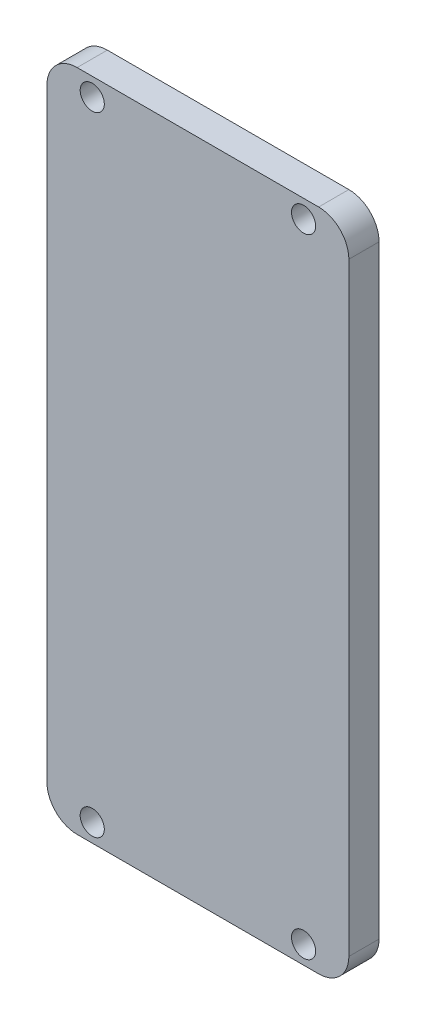
ISO-10303-21;
HEADER;
FILE_DESCRIPTION(('STEP AP214'),'2;1');
FILE_NAME('part.step','',(''),(''),'','','');
FILE_SCHEMA(('AUTOMOTIVE_DESIGN { 1 0 10303 214 1 1 1 1 }'));
ENDSEC;
DATA;
#1=APPLICATION_CONTEXT('core data for automotive mechanical design processes');
#2=APPLICATION_PROTOCOL_DEFINITION('international standard','automotive_design',2000,#1);
#3=PRODUCT_CONTEXT('',#1,'mechanical');
#4=PRODUCT('Part','Part','',(#3));
#5=PRODUCT_RELATED_PRODUCT_CATEGORY('part','',(#4));
#6=PRODUCT_DEFINITION_FORMATION('','',#4);
#7=PRODUCT_DEFINITION_CONTEXT('part definition',#1,'design');
#8=PRODUCT_DEFINITION('design','',#6,#7);
#9=PRODUCT_DEFINITION_SHAPE('','',#8);
#10=(LENGTH_UNIT() NAMED_UNIT(*) SI_UNIT(.MILLI.,.METRE.));
#11=(NAMED_UNIT(*) PLANE_ANGLE_UNIT() SI_UNIT($,.RADIAN.));
#12=(NAMED_UNIT(*) SI_UNIT($,.STERADIAN.) SOLID_ANGLE_UNIT());
#13=UNCERTAINTY_MEASURE_WITH_UNIT(LENGTH_MEASURE(1.E-05),#10,'distance_accuracy_value','');
#14=(GEOMETRIC_REPRESENTATION_CONTEXT(3) GLOBAL_UNCERTAINTY_ASSIGNED_CONTEXT((#13)) GLOBAL_UNIT_ASSIGNED_CONTEXT((#10,
#11,#12)) REPRESENTATION_CONTEXT('',''));
#15=CARTESIAN_POINT('',(0.,0.,0.));
#16=DIRECTION('',(0.,0.,1.));
#17=DIRECTION('',(1.,0.,0.));
#18=AXIS2_PLACEMENT_3D('',#15,#16,#17);
#19=CARTESIAN_POINT('',(5.,-105.,5.));
#20=DIRECTION('',(0.,0.,-1.));
#21=DIRECTION('',(-1.,0.,0.));
#22=AXIS2_PLACEMENT_3D('',#19,#20,#21);
#23=CYLINDRICAL_SURFACE('',#22,5.);
#24=CARTESIAN_POINT('',(5.,-105.,0.));
#25=DIRECTION('',(0.,0.,1.));
#26=DIRECTION('',(-1.,0.,0.));
#27=AXIS2_PLACEMENT_3D('',#24,#25,#26);
#28=CIRCLE('',#27,5.);
#29=CARTESIAN_POINT('',(0.,-105.,0.));
#30=VERTEX_POINT('',#29);
#31=CARTESIAN_POINT('',(5.00000000000004,-110.,0.));
#32=VERTEX_POINT('',#31);
#33=EDGE_CURVE('E139',#30,#32,#28,.T.);
#34=ORIENTED_EDGE('',*,*,#33,.T.);
#35=DIRECTION('',(0.,0.,-1.));
#36=VECTOR('',#35,1.);
#37=CARTESIAN_POINT('',(5.00000000000004,-110.,5.));
#38=LINE('',#37,#36);
#39=CARTESIAN_POINT('',(5.00000000000004,-110.,5.));
#40=VERTEX_POINT('',#39);
#41=EDGE_CURVE('E11',#40,#32,#38,.T.);
#42=ORIENTED_EDGE('',*,*,#41,.F.);
#43=CARTESIAN_POINT('',(5.,-105.,5.));
#44=DIRECTION('',(0.,0.,1.));
#45=DIRECTION('',(-1.,0.,0.));
#46=AXIS2_PLACEMENT_3D('',#43,#44,#45);
#47=CIRCLE('',#46,5.);
#48=CARTESIAN_POINT('',(0.,-105.,5.));
#49=VERTEX_POINT('',#48);
#50=EDGE_CURVE('E162',#49,#40,#47,.T.);
#51=ORIENTED_EDGE('',*,*,#50,.F.);
#52=DIRECTION('',(0.,0.,-1.));
#53=VECTOR('',#52,1.);
#54=CARTESIAN_POINT('',(0.,-105.,5.));
#55=LINE('',#54,#53);
#56=EDGE_CURVE('E135',#49,#30,#55,.T.);
#57=ORIENTED_EDGE('',*,*,#56,.T.);
#58=EDGE_LOOP('',(#34,#42,#51,#57));
#59=FACE_BOUND('',#58,.T.);
#60=ADVANCED_FACE('F38',(#59),#23,.T.);
#61=CARTESIAN_POINT('',(45.,-110.,5.));
#62=DIRECTION('',(0.,1.,0.));
#63=DIRECTION('',(-1.,0.,0.));
#64=AXIS2_PLACEMENT_3D('',#61,#62,#63);
#65=PLANE('',#64);
#66=DIRECTION('',(1.,0.,0.));
#67=VECTOR('',#66,1.);
#68=CARTESIAN_POINT('',(45.,-110.,0.));
#69=LINE('',#68,#67);
#70=CARTESIAN_POINT('',(45.,-110.,0.));
#71=VERTEX_POINT('',#70);
#72=EDGE_CURVE('E143',#32,#71,#69,.T.);
#73=ORIENTED_EDGE('',*,*,#72,.T.);
#74=DIRECTION('',(0.,0.,-1.));
#75=VECTOR('',#74,1.);
#76=CARTESIAN_POINT('',(45.,-110.,5.));
#77=LINE('',#76,#75);
#78=CARTESIAN_POINT('',(45.,-110.,5.));
#79=VERTEX_POINT('',#78);
#80=EDGE_CURVE('E47',#79,#71,#77,.T.);
#81=ORIENTED_EDGE('',*,*,#80,.F.);
#82=DIRECTION('',(1.,0.,0.));
#83=VECTOR('',#82,1.);
#84=CARTESIAN_POINT('',(45.,-110.,5.));
#85=LINE('',#84,#83);
#86=EDGE_CURVE('E98',#40,#79,#85,.T.);
#87=ORIENTED_EDGE('',*,*,#86,.F.);
#88=ORIENTED_EDGE('',*,*,#41,.T.);
#89=EDGE_LOOP('',(#73,#81,#87,#88));
#90=FACE_BOUND('',#89,.T.);
#91=ADVANCED_FACE('F267',(#90),#65,.F.);
#92=CARTESIAN_POINT('',(45.,-105.,5.));
#93=DIRECTION('',(0.,0.,-1.));
#94=DIRECTION('',(-1.,0.,0.));
#95=AXIS2_PLACEMENT_3D('',#92,#93,#94);
#96=CYLINDRICAL_SURFACE('',#95,5.);
#97=CARTESIAN_POINT('',(45.,-105.,0.));
#98=DIRECTION('',(0.,0.,1.));
#99=DIRECTION('',(-1.,0.,0.));
#100=AXIS2_PLACEMENT_3D('',#97,#98,#99);
#101=CIRCLE('',#100,5.);
#102=CARTESIAN_POINT('',(50.,-105.,0.));
#103=VERTEX_POINT('',#102);
#104=EDGE_CURVE('E147',#71,#103,#101,.T.);
#105=ORIENTED_EDGE('',*,*,#104,.T.);
#106=DIRECTION('',(0.,0.,-1.));
#107=VECTOR('',#106,1.);
#108=CARTESIAN_POINT('',(50.,-105.,5.));
#109=LINE('',#108,#107);
#110=CARTESIAN_POINT('',(50.,-105.,5.));
#111=VERTEX_POINT('',#110);
#112=EDGE_CURVE('E173',#111,#103,#109,.T.);
#113=ORIENTED_EDGE('',*,*,#112,.F.);
#114=CARTESIAN_POINT('',(45.,-105.,5.));
#115=DIRECTION('',(0.,0.,1.));
#116=DIRECTION('',(-1.,0.,0.));
#117=AXIS2_PLACEMENT_3D('',#114,#115,#116);
#118=CIRCLE('',#117,5.);
#119=EDGE_CURVE('E183',#79,#111,#118,.T.);
#120=ORIENTED_EDGE('',*,*,#119,.F.);
#121=ORIENTED_EDGE('',*,*,#80,.T.);
#122=EDGE_LOOP('',(#105,#113,#120,#121));
#123=FACE_BOUND('',#122,.T.);
#124=ADVANCED_FACE('F181',(#123),#96,.T.);
#125=CARTESIAN_POINT('',(50.,-5.00000000000003,5.));
#126=DIRECTION('',(-1.,0.,0.));
#127=DIRECTION('',(0.,-1.,0.));
#128=AXIS2_PLACEMENT_3D('',#125,#126,#127);
#129=PLANE('',#128);
#130=DIRECTION('',(0.,1.,0.));
#131=VECTOR('',#130,1.);
#132=CARTESIAN_POINT('',(50.,-5.00000000000003,0.));
#133=LINE('',#132,#131);
#134=CARTESIAN_POINT('',(50.,-5.00000000000003,0.));
#135=VERTEX_POINT('',#134);
#136=EDGE_CURVE('E150',#103,#135,#133,.T.);
#137=ORIENTED_EDGE('',*,*,#136,.T.);
#138=DIRECTION('',(0.,0.,-1.));
#139=VECTOR('',#138,1.);
#140=CARTESIAN_POINT('',(50.,-5.00000000000003,5.));
#141=LINE('',#140,#139);
#142=CARTESIAN_POINT('',(50.,-5.00000000000003,5.));
#143=VERTEX_POINT('',#142);
#144=EDGE_CURVE('E169',#143,#135,#141,.T.);
#145=ORIENTED_EDGE('',*,*,#144,.F.);
#146=DIRECTION('',(0.,1.,0.));
#147=VECTOR('',#146,1.);
#148=CARTESIAN_POINT('',(50.,-5.00000000000003,5.));
#149=LINE('',#148,#147);
#150=EDGE_CURVE('E196',#111,#143,#149,.T.);
#151=ORIENTED_EDGE('',*,*,#150,.F.);
#152=ORIENTED_EDGE('',*,*,#112,.T.);
#153=EDGE_LOOP('',(#137,#145,#151,#152));
#154=FACE_BOUND('',#153,.T.);
#155=ADVANCED_FACE('F191',(#154),#129,.F.);
#156=CARTESIAN_POINT('',(45.,-5.,5.));
#157=DIRECTION('',(0.,0.,-1.));
#158=DIRECTION('',(-1.,0.,0.));
#159=AXIS2_PLACEMENT_3D('',#156,#157,#158);
#160=CYLINDRICAL_SURFACE('',#159,5.);
#161=CARTESIAN_POINT('',(45.,-5.,0.));
#162=DIRECTION('',(0.,0.,1.));
#163=DIRECTION('',(-1.,0.,0.));
#164=AXIS2_PLACEMENT_3D('',#161,#162,#163);
#165=CIRCLE('',#164,5.);
#166=CARTESIAN_POINT('',(45.,0.,0.));
#167=VERTEX_POINT('',#166);
#168=EDGE_CURVE('E153',#135,#167,#165,.T.);
#169=ORIENTED_EDGE('',*,*,#168,.T.);
#170=DIRECTION('',(0.,0.,-1.));
#171=VECTOR('',#170,1.);
#172=CARTESIAN_POINT('',(45.,0.,5.));
#173=LINE('',#172,#171);
#174=CARTESIAN_POINT('',(45.,0.,5.));
#175=VERTEX_POINT('',#174);
#176=EDGE_CURVE('E128',#175,#167,#173,.T.);
#177=ORIENTED_EDGE('',*,*,#176,.F.);
#178=CARTESIAN_POINT('',(45.,-5.,5.));
#179=DIRECTION('',(0.,0.,1.));
#180=DIRECTION('',(-1.,0.,0.));
#181=AXIS2_PLACEMENT_3D('',#178,#179,#180);
#182=CIRCLE('',#181,5.);
#183=EDGE_CURVE('E117',#143,#175,#182,.T.);
#184=ORIENTED_EDGE('',*,*,#183,.F.);
#185=ORIENTED_EDGE('',*,*,#144,.T.);
#186=EDGE_LOOP('',(#169,#177,#184,#185));
#187=FACE_BOUND('',#186,.T.);
#188=ADVANCED_FACE('F194',(#187),#160,.T.);
#189=CARTESIAN_POINT('',(5.00000000000004,0.,5.));
#190=DIRECTION('',(0.,-1.,0.));
#191=DIRECTION('',(0.,0.,-1.));
#192=AXIS2_PLACEMENT_3D('',#189,#190,#191);
#193=PLANE('',#192);
#194=DIRECTION('',(-1.,0.,0.));
#195=VECTOR('',#194,1.);
#196=CARTESIAN_POINT('',(5.00000000000004,0.,0.));
#197=LINE('',#196,#195);
#198=CARTESIAN_POINT('',(5.00000000000004,0.,0.));
#199=VERTEX_POINT('',#198);
#200=EDGE_CURVE('E126',#167,#199,#197,.T.);
#201=ORIENTED_EDGE('',*,*,#200,.T.);
#202=DIRECTION('',(0.,0.,-1.));
#203=VECTOR('',#202,1.);
#204=CARTESIAN_POINT('',(5.00000000000004,0.,5.));
#205=LINE('',#204,#203);
#206=CARTESIAN_POINT('',(5.00000000000004,0.,5.));
#207=VERTEX_POINT('',#206);
#208=EDGE_CURVE('E123',#207,#199,#205,.T.);
#209=ORIENTED_EDGE('',*,*,#208,.F.);
#210=DIRECTION('',(-1.,0.,0.));
#211=VECTOR('',#210,1.);
#212=CARTESIAN_POINT('',(5.00000000000004,0.,5.));
#213=LINE('',#212,#211);
#214=EDGE_CURVE('E111',#175,#207,#213,.T.);
#215=ORIENTED_EDGE('',*,*,#214,.F.);
#216=ORIENTED_EDGE('',*,*,#176,.T.);
#217=EDGE_LOOP('',(#201,#209,#215,#216));
#218=FACE_BOUND('',#217,.T.);
#219=ADVANCED_FACE('F124',(#218),#193,.F.);
#220=CARTESIAN_POINT('',(5.,-5.,5.));
#221=DIRECTION('',(0.,0.,-1.));
#222=DIRECTION('',(-1.,0.,0.));
#223=AXIS2_PLACEMENT_3D('',#220,#221,#222);
#224=CYLINDRICAL_SURFACE('',#223,5.);
#225=CARTESIAN_POINT('',(5.,-5.,0.));
#226=DIRECTION('',(0.,0.,1.));
#227=DIRECTION('',(1.,0.,0.));
#228=AXIS2_PLACEMENT_3D('',#225,#226,#227);
#229=CIRCLE('',#228,5.);
#230=CARTESIAN_POINT('',(0.,-5.00000000000003,0.));
#231=VERTEX_POINT('',#230);
#232=EDGE_CURVE('E84',#199,#231,#229,.T.);
#233=ORIENTED_EDGE('',*,*,#232,.T.);
#234=DIRECTION('',(0.,0.,-1.));
#235=VECTOR('',#234,1.);
#236=CARTESIAN_POINT('',(0.,-5.00000000000003,5.));
#237=LINE('',#236,#235);
#238=CARTESIAN_POINT('',(0.,-5.00000000000003,5.));
#239=VERTEX_POINT('',#238);
#240=EDGE_CURVE('E129',#239,#231,#237,.T.);
#241=ORIENTED_EDGE('',*,*,#240,.F.);
#242=CARTESIAN_POINT('',(5.,-5.,5.));
#243=DIRECTION('',(0.,0.,1.));
#244=DIRECTION('',(1.,0.,0.));
#245=AXIS2_PLACEMENT_3D('',#242,#243,#244);
#246=CIRCLE('',#245,5.);
#247=EDGE_CURVE('E115',#207,#239,#246,.T.);
#248=ORIENTED_EDGE('',*,*,#247,.F.);
#249=ORIENTED_EDGE('',*,*,#208,.T.);
#250=EDGE_LOOP('',(#233,#241,#248,#249));
#251=FACE_BOUND('',#250,.T.);
#252=ADVANCED_FACE('F131',(#251),#224,.T.);
#253=CARTESIAN_POINT('',(0.,-105.,5.));
#254=DIRECTION('',(1.,0.,0.));
#255=DIRECTION('',(0.,1.,0.));
#256=AXIS2_PLACEMENT_3D('',#253,#254,#255);
#257=PLANE('',#256);
#258=DIRECTION('',(0.,-1.,0.));
#259=VECTOR('',#258,1.);
#260=CARTESIAN_POINT('',(0.,-105.,0.));
#261=LINE('',#260,#259);
#262=EDGE_CURVE('E90',#231,#30,#261,.T.);
#263=ORIENTED_EDGE('',*,*,#262,.T.);
#264=ORIENTED_EDGE('',*,*,#56,.F.);
#265=DIRECTION('',(0.,-1.,0.));
#266=VECTOR('',#265,1.);
#267=CARTESIAN_POINT('',(0.,-105.,5.));
#268=LINE('',#267,#266);
#269=EDGE_CURVE('E55',#239,#49,#268,.T.);
#270=ORIENTED_EDGE('',*,*,#269,.F.);
#271=ORIENTED_EDGE('',*,*,#240,.T.);
#272=EDGE_LOOP('',(#263,#264,#270,#271));
#273=FACE_BOUND('',#272,.T.);
#274=ADVANCED_FACE('F250',(#273),#257,.F.);
#275=CARTESIAN_POINT('',(5.,-105.,5.));
#276=DIRECTION('',(0.,0.,-1.));
#277=DIRECTION('',(-1.,0.,0.));
#278=AXIS2_PLACEMENT_3D('',#275,#276,#277);
#279=PLANE('',#278);
#280=CARTESIAN_POINT('',(42.5,-107.,5.));
#281=DIRECTION('',(0.,0.,1.));
#282=DIRECTION('',(1.,0.,0.));
#283=AXIS2_PLACEMENT_3D('',#280,#281,#282);
#284=CIRCLE('',#283,2.);
#285=CARTESIAN_POINT('',(44.5,-107.,5.));
#286=VERTEX_POINT('',#285);
#287=EDGE_CURVE('E223',#286,#286,#284,.T.);
#288=ORIENTED_EDGE('',*,*,#287,.F.);
#289=EDGE_LOOP('',(#288));
#290=FACE_BOUND('',#289,.T.);
#291=CARTESIAN_POINT('',(7.5,-3.,5.));
#292=DIRECTION('',(0.,0.,1.));
#293=DIRECTION('',(1.,0.,0.));
#294=AXIS2_PLACEMENT_3D('',#291,#292,#293);
#295=CIRCLE('',#294,2.);
#296=CARTESIAN_POINT('',(9.5,-3.,5.));
#297=VERTEX_POINT('',#296);
#298=EDGE_CURVE('E214',#297,#297,#295,.T.);
#299=ORIENTED_EDGE('',*,*,#298,.F.);
#300=EDGE_LOOP('',(#299));
#301=FACE_BOUND('',#300,.T.);
#302=CARTESIAN_POINT('',(42.5,-3.,5.));
#303=DIRECTION('',(0.,0.,1.));
#304=DIRECTION('',(1.,0.,0.));
#305=AXIS2_PLACEMENT_3D('',#302,#303,#304);
#306=CIRCLE('',#305,2.);
#307=CARTESIAN_POINT('',(44.5,-3.,5.));
#308=VERTEX_POINT('',#307);
#309=EDGE_CURVE('E230',#308,#308,#306,.T.);
#310=ORIENTED_EDGE('',*,*,#309,.F.);
#311=EDGE_LOOP('',(#310));
#312=FACE_BOUND('',#311,.T.);
#313=CARTESIAN_POINT('',(7.5,-107.,5.));
#314=DIRECTION('',(0.,0.,1.));
#315=DIRECTION('',(1.,0.,0.));
#316=AXIS2_PLACEMENT_3D('',#313,#314,#315);
#317=CIRCLE('',#316,2.);
#318=CARTESIAN_POINT('',(9.5,-107.,5.));
#319=VERTEX_POINT('',#318);
#320=EDGE_CURVE('E206',#319,#319,#317,.T.);
#321=ORIENTED_EDGE('',*,*,#320,.F.);
#322=EDGE_LOOP('',(#321));
#323=FACE_BOUND('',#322,.T.);
#324=ORIENTED_EDGE('',*,*,#50,.T.);
#325=ORIENTED_EDGE('',*,*,#86,.T.);
#326=ORIENTED_EDGE('',*,*,#119,.T.);
#327=ORIENTED_EDGE('',*,*,#150,.T.);
#328=ORIENTED_EDGE('',*,*,#183,.T.);
#329=ORIENTED_EDGE('',*,*,#214,.T.);
#330=ORIENTED_EDGE('',*,*,#247,.T.);
#331=ORIENTED_EDGE('',*,*,#269,.T.);
#332=EDGE_LOOP('',(#324,#325,#326,#327,#328,#329,#330,#331));
#333=FACE_BOUND('',#332,.T.);
#334=ADVANCED_FACE('F113',(#290,#301,#312,#323,#333),#279,.F.);
#335=CARTESIAN_POINT('',(5.,-105.,0.));
#336=DIRECTION('',(0.,0.,-1.));
#337=DIRECTION('',(-1.,0.,0.));
#338=AXIS2_PLACEMENT_3D('',#335,#336,#337);
#339=PLANE('',#338);
#340=CARTESIAN_POINT('',(42.5,-107.,0.));
#341=DIRECTION('',(0.,0.,1.));
#342=DIRECTION('',(1.,0.,0.));
#343=AXIS2_PLACEMENT_3D('',#340,#341,#342);
#344=CIRCLE('',#343,2.);
#345=CARTESIAN_POINT('',(44.5,-107.,0.));
#346=VERTEX_POINT('',#345);
#347=EDGE_CURVE('E210',#346,#346,#344,.T.);
#348=ORIENTED_EDGE('',*,*,#347,.T.);
#349=EDGE_LOOP('',(#348));
#350=FACE_BOUND('',#349,.T.);
#351=CARTESIAN_POINT('',(7.5,-3.,0.));
#352=DIRECTION('',(0.,0.,1.));
#353=DIRECTION('',(1.,0.,0.));
#354=AXIS2_PLACEMENT_3D('',#351,#352,#353);
#355=CIRCLE('',#354,2.);
#356=CARTESIAN_POINT('',(9.5,-3.,0.));
#357=VERTEX_POINT('',#356);
#358=EDGE_CURVE('E218',#357,#357,#355,.T.);
#359=ORIENTED_EDGE('',*,*,#358,.T.);
#360=EDGE_LOOP('',(#359));
#361=FACE_BOUND('',#360,.T.);
#362=CARTESIAN_POINT('',(42.5,-3.,0.));
#363=DIRECTION('',(0.,0.,1.));
#364=DIRECTION('',(1.,0.,0.));
#365=AXIS2_PLACEMENT_3D('',#362,#363,#364);
#366=CIRCLE('',#365,2.);
#367=CARTESIAN_POINT('',(44.5,-3.,0.));
#368=VERTEX_POINT('',#367);
#369=EDGE_CURVE('E219',#368,#368,#366,.T.);
#370=ORIENTED_EDGE('',*,*,#369,.T.);
#371=EDGE_LOOP('',(#370));
#372=FACE_BOUND('',#371,.T.);
#373=CARTESIAN_POINT('',(7.5,-107.,0.));
#374=DIRECTION('',(0.,0.,1.));
#375=DIRECTION('',(1.,0.,0.));
#376=AXIS2_PLACEMENT_3D('',#373,#374,#375);
#377=CIRCLE('',#376,2.);
#378=CARTESIAN_POINT('',(9.5,-107.,0.));
#379=VERTEX_POINT('',#378);
#380=EDGE_CURVE('E144',#379,#379,#377,.T.);
#381=ORIENTED_EDGE('',*,*,#380,.T.);
#382=EDGE_LOOP('',(#381));
#383=FACE_BOUND('',#382,.T.);
#384=ORIENTED_EDGE('',*,*,#33,.F.);
#385=ORIENTED_EDGE('',*,*,#262,.F.);
#386=ORIENTED_EDGE('',*,*,#232,.F.);
#387=ORIENTED_EDGE('',*,*,#200,.F.);
#388=ORIENTED_EDGE('',*,*,#168,.F.);
#389=ORIENTED_EDGE('',*,*,#136,.F.);
#390=ORIENTED_EDGE('',*,*,#104,.F.);
#391=ORIENTED_EDGE('',*,*,#72,.F.);
#392=EDGE_LOOP('',(#384,#385,#386,#387,#388,#389,#390,#391));
#393=FACE_BOUND('',#392,.T.);
#394=ADVANCED_FACE('F187',(#350,#361,#372,#383,#393),#339,.T.);
#395=CARTESIAN_POINT('',(7.5,-107.,0.));
#396=DIRECTION('',(0.,0.,1.));
#397=DIRECTION('',(1.,0.,0.));
#398=AXIS2_PLACEMENT_3D('',#395,#396,#397);
#399=CYLINDRICAL_SURFACE('',#398,2.);
#400=ORIENTED_EDGE('',*,*,#380,.F.);
#401=EDGE_LOOP('',(#400));
#402=FACE_BOUND('',#401,.T.);
#403=ORIENTED_EDGE('',*,*,#320,.T.);
#404=EDGE_LOOP('',(#403));
#405=FACE_BOUND('',#404,.T.);
#406=ADVANCED_FACE('F244',(#402,#405),#399,.F.);
#407=CARTESIAN_POINT('',(42.5,-3.,0.));
#408=DIRECTION('',(0.,0.,1.));
#409=DIRECTION('',(1.,0.,0.));
#410=AXIS2_PLACEMENT_3D('',#407,#408,#409);
#411=CYLINDRICAL_SURFACE('',#410,2.);
#412=ORIENTED_EDGE('',*,*,#369,.F.);
#413=EDGE_LOOP('',(#412));
#414=FACE_BOUND('',#413,.T.);
#415=ORIENTED_EDGE('',*,*,#309,.T.);
#416=EDGE_LOOP('',(#415));
#417=FACE_BOUND('',#416,.T.);
#418=ADVANCED_FACE('F240',(#414,#417),#411,.F.);
#419=CARTESIAN_POINT('',(7.5,-3.,0.));
#420=DIRECTION('',(0.,0.,1.));
#421=DIRECTION('',(1.,0.,0.));
#422=AXIS2_PLACEMENT_3D('',#419,#420,#421);
#423=CYLINDRICAL_SURFACE('',#422,2.);
#424=ORIENTED_EDGE('',*,*,#358,.F.);
#425=EDGE_LOOP('',(#424));
#426=FACE_BOUND('',#425,.T.);
#427=ORIENTED_EDGE('',*,*,#298,.T.);
#428=EDGE_LOOP('',(#427));
#429=FACE_BOUND('',#428,.T.);
#430=ADVANCED_FACE('F243',(#426,#429),#423,.F.);
#431=CARTESIAN_POINT('',(42.5,-107.,0.));
#432=DIRECTION('',(0.,0.,1.));
#433=DIRECTION('',(1.,0.,0.));
#434=AXIS2_PLACEMENT_3D('',#431,#432,#433);
#435=CYLINDRICAL_SURFACE('',#434,2.);
#436=ORIENTED_EDGE('',*,*,#347,.F.);
#437=EDGE_LOOP('',(#436));
#438=FACE_BOUND('',#437,.T.);
#439=ORIENTED_EDGE('',*,*,#287,.T.);
#440=EDGE_LOOP('',(#439));
#441=FACE_BOUND('',#440,.T.);
#442=ADVANCED_FACE('F338',(#438,#441),#435,.F.);
#443=CLOSED_SHELL('',(#60,#91,#124,#155,#188,#219,#252,#274,#334,#394,#406,#418,#430,#442));
#444=MANIFOLD_SOLID_BREP('B2',#443);
#445=ADVANCED_BREP_SHAPE_REPRESENTATION('',(#18,#444),#14);
#446=SHAPE_DEFINITION_REPRESENTATION(#9,#445);
ENDSEC;
END-ISO-10303-21;
